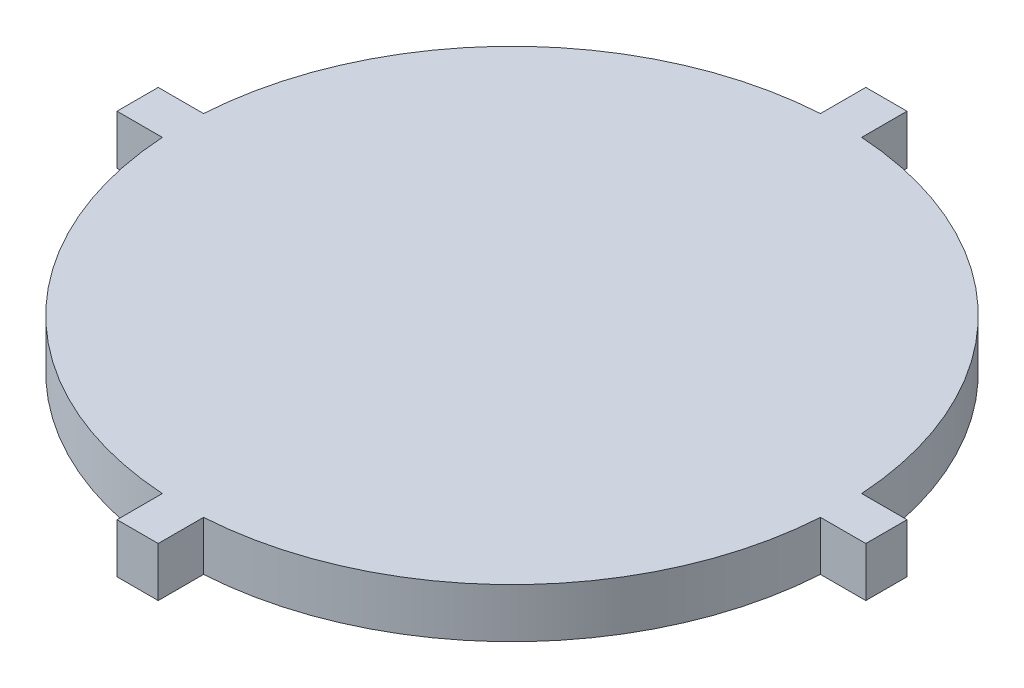
ISO-10303-21;
HEADER;
FILE_DESCRIPTION(('STEP AP214'),'2;1');
FILE_NAME('part.step','',(''),(''),'','','');
FILE_SCHEMA(('AUTOMOTIVE_DESIGN { 1 0 10303 214 1 1 1 1 }'));
ENDSEC;
DATA;
#1=APPLICATION_CONTEXT('core data for automotive mechanical design processes');
#2=APPLICATION_PROTOCOL_DEFINITION('international standard','automotive_design',2000,#1);
#3=PRODUCT_CONTEXT('',#1,'mechanical');
#4=PRODUCT('Part','Part','',(#3));
#5=PRODUCT_RELATED_PRODUCT_CATEGORY('part','',(#4));
#6=PRODUCT_DEFINITION_FORMATION('','',#4);
#7=PRODUCT_DEFINITION_CONTEXT('part definition',#1,'design');
#8=PRODUCT_DEFINITION('design','',#6,#7);
#9=PRODUCT_DEFINITION_SHAPE('','',#8);
#10=(LENGTH_UNIT() NAMED_UNIT(*) SI_UNIT(.MILLI.,.METRE.));
#11=(NAMED_UNIT(*) PLANE_ANGLE_UNIT() SI_UNIT($,.RADIAN.));
#12=(NAMED_UNIT(*) SI_UNIT($,.STERADIAN.) SOLID_ANGLE_UNIT());
#13=UNCERTAINTY_MEASURE_WITH_UNIT(LENGTH_MEASURE(1.E-05),#10,'distance_accuracy_value','');
#14=(GEOMETRIC_REPRESENTATION_CONTEXT(3) GLOBAL_UNCERTAINTY_ASSIGNED_CONTEXT((#13)) GLOBAL_UNIT_ASSIGNED_CONTEXT((#10,
#11,#12)) REPRESENTATION_CONTEXT('',''));
#15=CARTESIAN_POINT('',(0.,0.,0.));
#16=DIRECTION('',(0.,0.,1.));
#17=DIRECTION('',(1.,0.,0.));
#18=AXIS2_PLACEMENT_3D('',#15,#16,#17);
#19=CARTESIAN_POINT('',(0.,15.24,0.));
#20=DIRECTION('',(0.,-1.,0.));
#21=DIRECTION('',(0.,0.,-1.));
#22=AXIS2_PLACEMENT_3D('',#19,#20,#21);
#23=CYLINDRICAL_SURFACE('',#22,101.6);
#24=CARTESIAN_POINT('',(0.,0.,0.));
#25=DIRECTION('',(0.,1.,0.));
#26=DIRECTION('',(0.,0.,1.));
#27=AXIS2_PLACEMENT_3D('',#24,#25,#26);
#28=CIRCLE('',#27,101.6);
#29=CARTESIAN_POINT('',(101.401368333963,0.,-6.35));
#30=VERTEX_POINT('',#29);
#31=CARTESIAN_POINT('',(6.35000000000001,0.,-101.401368333963));
#32=VERTEX_POINT('',#31);
#33=EDGE_CURVE('E187',#30,#32,#28,.T.);
#34=ORIENTED_EDGE('',*,*,#33,.T.);
#35=DIRECTION('',(0.,-1.,0.));
#36=VECTOR('',#35,1.);
#37=CARTESIAN_POINT('',(6.35000000000001,15.24,-101.401368333963));
#38=LINE('',#37,#36);
#39=CARTESIAN_POINT('',(6.35000000000001,15.24,-101.401368333963));
#40=VERTEX_POINT('',#39);
#41=EDGE_CURVE('E11',#40,#32,#38,.T.);
#42=ORIENTED_EDGE('',*,*,#41,.F.);
#43=CARTESIAN_POINT('',(0.,15.24,0.));
#44=DIRECTION('',(0.,1.,0.));
#45=DIRECTION('',(0.,0.,1.));
#46=AXIS2_PLACEMENT_3D('',#43,#44,#45);
#47=CIRCLE('',#46,101.6);
#48=CARTESIAN_POINT('',(101.401368333963,15.24,-6.35));
#49=VERTEX_POINT('',#48);
#50=EDGE_CURVE('E217',#49,#40,#47,.T.);
#51=ORIENTED_EDGE('',*,*,#50,.F.);
#52=DIRECTION('',(0.,-1.,0.));
#53=VECTOR('',#52,1.);
#54=CARTESIAN_POINT('',(101.401368333963,15.24,-6.35));
#55=LINE('',#54,#53);
#56=EDGE_CURVE('E183',#49,#30,#55,.T.);
#57=ORIENTED_EDGE('',*,*,#56,.T.);
#58=EDGE_LOOP('',(#34,#42,#51,#57));
#59=FACE_BOUND('',#58,.T.);
#60=ADVANCED_FACE('F43',(#59),#23,.T.);
#61=CARTESIAN_POINT('',(6.35000000000001,15.24,-101.401368333963));
#62=DIRECTION('',(-1.,0.,0.));
#63=DIRECTION('',(0.,0.,1.));
#64=AXIS2_PLACEMENT_3D('',#61,#62,#63);
#65=PLANE('',#64);
#66=DIRECTION('',(0.,0.,-1.));
#67=VECTOR('',#66,1.);
#68=CARTESIAN_POINT('',(6.35000000000001,0.,-101.401368333963));
#69=LINE('',#68,#67);
#70=CARTESIAN_POINT('',(6.35,0.,-115.371368333963));
#71=VERTEX_POINT('',#70);
#72=EDGE_CURVE('E190',#32,#71,#69,.T.);
#73=ORIENTED_EDGE('',*,*,#72,.T.);
#74=DIRECTION('',(0.,-1.,0.));
#75=VECTOR('',#74,1.);
#76=CARTESIAN_POINT('',(6.35,15.24,-115.371368333963));
#77=LINE('',#76,#75);
#78=CARTESIAN_POINT('',(6.35,15.24,-115.371368333963));
#79=VERTEX_POINT('',#78);
#80=EDGE_CURVE('E51',#79,#71,#77,.T.);
#81=ORIENTED_EDGE('',*,*,#80,.F.);
#82=DIRECTION('',(0.,0.,-1.));
#83=VECTOR('',#82,1.);
#84=CARTESIAN_POINT('',(6.35000000000001,15.24,-101.401368333963));
#85=LINE('',#84,#83);
#86=EDGE_CURVE('E125',#40,#79,#85,.T.);
#87=ORIENTED_EDGE('',*,*,#86,.F.);
#88=ORIENTED_EDGE('',*,*,#41,.T.);
#89=EDGE_LOOP('',(#73,#81,#87,#88));
#90=FACE_BOUND('',#89,.T.);
#91=ADVANCED_FACE('F315',(#90),#65,.F.);
#92=CARTESIAN_POINT('',(-6.35,15.24,-115.371368333963));
#93=DIRECTION('',(0.,0.,1.));
#94=DIRECTION('',(1.,0.,0.));
#95=AXIS2_PLACEMENT_3D('',#92,#93,#94);
#96=PLANE('',#95);
#97=DIRECTION('',(-1.,0.,0.));
#98=VECTOR('',#97,1.);
#99=CARTESIAN_POINT('',(-6.35,0.,-115.371368333963));
#100=LINE('',#99,#98);
#101=CARTESIAN_POINT('',(-6.35,0.,-115.371368333963));
#102=VERTEX_POINT('',#101);
#103=EDGE_CURVE('E192',#71,#102,#100,.T.);
#104=ORIENTED_EDGE('',*,*,#103,.T.);
#105=DIRECTION('',(0.,-1.,0.));
#106=VECTOR('',#105,1.);
#107=CARTESIAN_POINT('',(-6.35,15.24,-115.371368333963));
#108=LINE('',#107,#106);
#109=CARTESIAN_POINT('',(-6.35,15.24,-115.371368333963));
#110=VERTEX_POINT('',#109);
#111=EDGE_CURVE('E248',#110,#102,#108,.T.);
#112=ORIENTED_EDGE('',*,*,#111,.F.);
#113=DIRECTION('',(-1.,0.,0.));
#114=VECTOR('',#113,1.);
#115=CARTESIAN_POINT('',(-6.35,15.24,-115.371368333963));
#116=LINE('',#115,#114);
#117=EDGE_CURVE('E256',#79,#110,#116,.T.);
#118=ORIENTED_EDGE('',*,*,#117,.F.);
#119=ORIENTED_EDGE('',*,*,#80,.T.);
#120=EDGE_LOOP('',(#104,#112,#118,#119));
#121=FACE_BOUND('',#120,.T.);
#122=ADVANCED_FACE('F254',(#121),#96,.F.);
#123=CARTESIAN_POINT('',(-6.34999999999999,15.24,-101.401368333963));
#124=DIRECTION('',(1.,0.,0.));
#125=DIRECTION('',(0.,0.,-1.));
#126=AXIS2_PLACEMENT_3D('',#123,#124,#125);
#127=PLANE('',#126);
#128=DIRECTION('',(0.,0.,1.));
#129=VECTOR('',#128,1.);
#130=CARTESIAN_POINT('',(-6.34999999999999,0.,-101.401368333963));
#131=LINE('',#130,#129);
#132=CARTESIAN_POINT('',(-6.34999999999999,0.,-101.401368333963));
#133=VERTEX_POINT('',#132);
#134=EDGE_CURVE('E194',#102,#133,#131,.T.);
#135=ORIENTED_EDGE('',*,*,#134,.T.);
#136=DIRECTION('',(0.,-1.,0.));
#137=VECTOR('',#136,1.);
#138=CARTESIAN_POINT('',(-6.34999999999999,15.24,-101.401368333963));
#139=LINE('',#138,#137);
#140=CARTESIAN_POINT('',(-6.34999999999999,15.24,-101.401368333963));
#141=VERTEX_POINT('',#140);
#142=EDGE_CURVE('E245',#141,#133,#139,.T.);
#143=ORIENTED_EDGE('',*,*,#142,.F.);
#144=DIRECTION('',(0.,0.,1.));
#145=VECTOR('',#144,1.);
#146=CARTESIAN_POINT('',(-6.34999999999999,15.24,-101.401368333963));
#147=LINE('',#146,#145);
#148=EDGE_CURVE('E274',#110,#141,#147,.T.);
#149=ORIENTED_EDGE('',*,*,#148,.F.);
#150=ORIENTED_EDGE('',*,*,#111,.T.);
#151=EDGE_LOOP('',(#135,#143,#149,#150));
#152=FACE_BOUND('',#151,.T.);
#153=ADVANCED_FACE('F265',(#152),#127,.F.);
#154=CARTESIAN_POINT('',(0.,15.24,0.));
#155=DIRECTION('',(0.,-1.,0.));
#156=DIRECTION('',(0.,0.,-1.));
#157=AXIS2_PLACEMENT_3D('',#154,#155,#156);
#158=CYLINDRICAL_SURFACE('',#157,101.6);
#159=CARTESIAN_POINT('',(0.,0.,0.));
#160=DIRECTION('',(0.,1.,0.));
#161=DIRECTION('',(0.,0.,1.));
#162=AXIS2_PLACEMENT_3D('',#159,#160,#161);
#163=CIRCLE('',#162,101.6);
#164=CARTESIAN_POINT('',(-101.401368333963,0.,-6.34999999999998));
#165=VERTEX_POINT('',#164);
#166=EDGE_CURVE('E196',#133,#165,#163,.T.);
#167=ORIENTED_EDGE('',*,*,#166,.T.);
#168=DIRECTION('',(0.,-1.,0.));
#169=VECTOR('',#168,1.);
#170=CARTESIAN_POINT('',(-101.401368333963,15.24,-6.34999999999998));
#171=LINE('',#170,#169);
#172=CARTESIAN_POINT('',(-101.401368333963,15.24,-6.34999999999998));
#173=VERTEX_POINT('',#172);
#174=EDGE_CURVE('E242',#173,#165,#171,.T.);
#175=ORIENTED_EDGE('',*,*,#174,.F.);
#176=CARTESIAN_POINT('',(0.,15.24,0.));
#177=DIRECTION('',(0.,1.,0.));
#178=DIRECTION('',(0.,0.,1.));
#179=AXIS2_PLACEMENT_3D('',#176,#177,#178);
#180=CIRCLE('',#179,101.6);
#181=EDGE_CURVE('E271',#141,#173,#180,.T.);
#182=ORIENTED_EDGE('',*,*,#181,.F.);
#183=ORIENTED_EDGE('',*,*,#142,.T.);
#184=EDGE_LOOP('',(#167,#175,#182,#183));
#185=FACE_BOUND('',#184,.T.);
#186=ADVANCED_FACE('F269',(#185),#158,.T.);
#187=CARTESIAN_POINT('',(-101.401368333963,15.24,-6.35));
#188=DIRECTION('',(0.,0.,1.));
#189=DIRECTION('',(1.,0.,0.));
#190=AXIS2_PLACEMENT_3D('',#187,#188,#189);
#191=PLANE('',#190);
#192=DIRECTION('',(-1.,0.,0.));
#193=VECTOR('',#192,1.);
#194=CARTESIAN_POINT('',(-101.401368333963,0.,-6.35));
#195=LINE('',#194,#193);
#196=CARTESIAN_POINT('',(-115.371368333963,0.,-6.35000000000072));
#197=VERTEX_POINT('',#196);
#198=EDGE_CURVE('E198',#165,#197,#195,.T.);
#199=ORIENTED_EDGE('',*,*,#198,.T.);
#200=DIRECTION('',(0.,-1.,0.));
#201=VECTOR('',#200,1.);
#202=CARTESIAN_POINT('',(-115.371368333963,15.24,-6.35000000000072));
#203=LINE('',#202,#201);
#204=CARTESIAN_POINT('',(-115.371368333963,15.24,-6.35000000000072));
#205=VERTEX_POINT('',#204);
#206=EDGE_CURVE('E239',#205,#197,#203,.T.);
#207=ORIENTED_EDGE('',*,*,#206,.F.);
#208=DIRECTION('',(-1.,0.,0.));
#209=VECTOR('',#208,1.);
#210=CARTESIAN_POINT('',(-101.401368333963,15.24,-6.35));
#211=LINE('',#210,#209);
#212=EDGE_CURVE('E273',#173,#205,#211,.T.);
#213=ORIENTED_EDGE('',*,*,#212,.F.);
#214=ORIENTED_EDGE('',*,*,#174,.T.);
#215=EDGE_LOOP('',(#199,#207,#213,#214));
#216=FACE_BOUND('',#215,.T.);
#217=ADVANCED_FACE('F328',(#216),#191,.F.);
#218=CARTESIAN_POINT('',(-115.371368333963,15.24,-6.35000000000072));
#219=DIRECTION('',(1.,0.,0.));
#220=DIRECTION('',(0.,0.,-1.));
#221=AXIS2_PLACEMENT_3D('',#218,#219,#220);
#222=PLANE('',#221);
#223=DIRECTION('',(0.,0.,1.));
#224=VECTOR('',#223,1.);
#225=CARTESIAN_POINT('',(-115.371368333963,0.,-6.35000000000072));
#226=LINE('',#225,#224);
#227=CARTESIAN_POINT('',(-115.371368333963,0.,6.34999999999928));
#228=VERTEX_POINT('',#227);
#229=EDGE_CURVE('E200',#197,#228,#226,.T.);
#230=ORIENTED_EDGE('',*,*,#229,.T.);
#231=DIRECTION('',(0.,-1.,0.));
#232=VECTOR('',#231,1.);
#233=CARTESIAN_POINT('',(-115.371368333963,15.24,6.34999999999928));
#234=LINE('',#233,#232);
#235=CARTESIAN_POINT('',(-115.371368333963,15.24,6.34999999999928));
#236=VERTEX_POINT('',#235);
#237=EDGE_CURVE('E236',#236,#228,#234,.T.);
#238=ORIENTED_EDGE('',*,*,#237,.F.);
#239=DIRECTION('',(0.,0.,1.));
#240=VECTOR('',#239,1.);
#241=CARTESIAN_POINT('',(-115.371368333963,15.24,-6.35000000000072));
#242=LINE('',#241,#240);
#243=EDGE_CURVE('E276',#205,#236,#242,.T.);
#244=ORIENTED_EDGE('',*,*,#243,.F.);
#245=ORIENTED_EDGE('',*,*,#206,.T.);
#246=EDGE_LOOP('',(#230,#238,#244,#245));
#247=FACE_BOUND('',#246,.T.);
#248=ADVANCED_FACE('F331',(#247),#222,.F.);
#249=CARTESIAN_POINT('',(-101.401368333963,15.24,6.35));
#250=DIRECTION('',(0.,0.,-1.));
#251=DIRECTION('',(-1.,0.,0.));
#252=AXIS2_PLACEMENT_3D('',#249,#250,#251);
#253=PLANE('',#252);
#254=DIRECTION('',(1.,0.,0.));
#255=VECTOR('',#254,1.);
#256=CARTESIAN_POINT('',(-101.401368333963,0.,6.35));
#257=LINE('',#256,#255);
#258=CARTESIAN_POINT('',(-101.401368333963,0.,6.35));
#259=VERTEX_POINT('',#258);
#260=EDGE_CURVE('E202',#228,#259,#257,.T.);
#261=ORIENTED_EDGE('',*,*,#260,.T.);
#262=DIRECTION('',(0.,-1.,0.));
#263=VECTOR('',#262,1.);
#264=CARTESIAN_POINT('',(-101.401368333963,15.24,6.35));
#265=LINE('',#264,#263);
#266=CARTESIAN_POINT('',(-101.401368333963,15.24,6.35));
#267=VERTEX_POINT('',#266);
#268=EDGE_CURVE('E233',#267,#259,#265,.T.);
#269=ORIENTED_EDGE('',*,*,#268,.F.);
#270=DIRECTION('',(1.,0.,0.));
#271=VECTOR('',#270,1.);
#272=CARTESIAN_POINT('',(-101.401368333963,15.24,6.35));
#273=LINE('',#272,#271);
#274=EDGE_CURVE('E282',#236,#267,#273,.T.);
#275=ORIENTED_EDGE('',*,*,#274,.F.);
#276=ORIENTED_EDGE('',*,*,#237,.T.);
#277=EDGE_LOOP('',(#261,#269,#275,#276));
#278=FACE_BOUND('',#277,.T.);
#279=ADVANCED_FACE('F335',(#278),#253,.F.);
#280=CARTESIAN_POINT('',(0.,15.24,0.));
#281=DIRECTION('',(0.,-1.,0.));
#282=DIRECTION('',(0.,0.,-1.));
#283=AXIS2_PLACEMENT_3D('',#280,#281,#282);
#284=CYLINDRICAL_SURFACE('',#283,101.6);
#285=CARTESIAN_POINT('',(0.,0.,0.));
#286=DIRECTION('',(0.,1.,0.));
#287=DIRECTION('',(0.,0.,1.));
#288=AXIS2_PLACEMENT_3D('',#285,#286,#287);
#289=CIRCLE('',#288,101.6);
#290=CARTESIAN_POINT('',(-6.34999999999999,0.,101.401368333963));
#291=VERTEX_POINT('',#290);
#292=EDGE_CURVE('E204',#259,#291,#289,.T.);
#293=ORIENTED_EDGE('',*,*,#292,.T.);
#294=DIRECTION('',(0.,-1.,0.));
#295=VECTOR('',#294,1.);
#296=CARTESIAN_POINT('',(-6.34999999999999,15.24,101.401368333963));
#297=LINE('',#296,#295);
#298=CARTESIAN_POINT('',(-6.34999999999999,15.24,101.401368333963));
#299=VERTEX_POINT('',#298);
#300=EDGE_CURVE('E230',#299,#291,#297,.T.);
#301=ORIENTED_EDGE('',*,*,#300,.F.);
#302=CARTESIAN_POINT('',(0.,15.24,0.));
#303=DIRECTION('',(0.,1.,0.));
#304=DIRECTION('',(0.,0.,1.));
#305=AXIS2_PLACEMENT_3D('',#302,#303,#304);
#306=CIRCLE('',#305,101.6);
#307=EDGE_CURVE('E284',#267,#299,#306,.T.);
#308=ORIENTED_EDGE('',*,*,#307,.F.);
#309=ORIENTED_EDGE('',*,*,#268,.T.);
#310=EDGE_LOOP('',(#293,#301,#308,#309));
#311=FACE_BOUND('',#310,.T.);
#312=ADVANCED_FACE('F339',(#311),#284,.T.);
#313=CARTESIAN_POINT('',(-6.34999999999999,15.24,101.401368333963));
#314=DIRECTION('',(1.,0.,0.));
#315=DIRECTION('',(0.,0.,-1.));
#316=AXIS2_PLACEMENT_3D('',#313,#314,#315);
#317=PLANE('',#316);
#318=DIRECTION('',(0.,0.,1.));
#319=VECTOR('',#318,1.);
#320=CARTESIAN_POINT('',(-6.34999999999999,0.,101.401368333963));
#321=LINE('',#320,#319);
#322=CARTESIAN_POINT('',(-6.34999999999999,0.,115.371368333963));
#323=VERTEX_POINT('',#322);
#324=EDGE_CURVE('E206',#291,#323,#321,.T.);
#325=ORIENTED_EDGE('',*,*,#324,.T.);
#326=DIRECTION('',(0.,-1.,0.));
#327=VECTOR('',#326,1.);
#328=CARTESIAN_POINT('',(-6.34999999999999,15.24,115.371368333963));
#329=LINE('',#328,#327);
#330=CARTESIAN_POINT('',(-6.34999999999999,15.24,115.371368333963));
#331=VERTEX_POINT('',#330);
#332=EDGE_CURVE('E227',#331,#323,#329,.T.);
#333=ORIENTED_EDGE('',*,*,#332,.F.);
#334=DIRECTION('',(0.,0.,1.));
#335=VECTOR('',#334,1.);
#336=CARTESIAN_POINT('',(-6.34999999999999,15.24,101.401368333963));
#337=LINE('',#336,#335);
#338=EDGE_CURVE('E286',#299,#331,#337,.T.);
#339=ORIENTED_EDGE('',*,*,#338,.F.);
#340=ORIENTED_EDGE('',*,*,#300,.T.);
#341=EDGE_LOOP('',(#325,#333,#339,#340));
#342=FACE_BOUND('',#341,.T.);
#343=ADVANCED_FACE('F343',(#342),#317,.F.);
#344=CARTESIAN_POINT('',(-6.34999999999999,15.24,115.371368333963));
#345=DIRECTION('',(0.,0.,-1.));
#346=DIRECTION('',(-1.,0.,0.));
#347=AXIS2_PLACEMENT_3D('',#344,#345,#346);
#348=PLANE('',#347);
#349=DIRECTION('',(1.,0.,0.));
#350=VECTOR('',#349,1.);
#351=CARTESIAN_POINT('',(-6.34999999999999,0.,115.371368333963));
#352=LINE('',#351,#350);
#353=CARTESIAN_POINT('',(6.35000000000001,0.,115.371368333963));
#354=VERTEX_POINT('',#353);
#355=EDGE_CURVE('E208',#323,#354,#352,.T.);
#356=ORIENTED_EDGE('',*,*,#355,.T.);
#357=DIRECTION('',(0.,-1.,0.));
#358=VECTOR('',#357,1.);
#359=CARTESIAN_POINT('',(6.35000000000001,15.24,115.371368333963));
#360=LINE('',#359,#358);
#361=CARTESIAN_POINT('',(6.35000000000001,15.24,115.371368333963));
#362=VERTEX_POINT('',#361);
#363=EDGE_CURVE('E224',#362,#354,#360,.T.);
#364=ORIENTED_EDGE('',*,*,#363,.F.);
#365=DIRECTION('',(1.,0.,0.));
#366=VECTOR('',#365,1.);
#367=CARTESIAN_POINT('',(-6.34999999999999,15.24,115.371368333963));
#368=LINE('',#367,#366);
#369=EDGE_CURVE('E288',#331,#362,#368,.T.);
#370=ORIENTED_EDGE('',*,*,#369,.F.);
#371=ORIENTED_EDGE('',*,*,#332,.T.);
#372=EDGE_LOOP('',(#356,#364,#370,#371));
#373=FACE_BOUND('',#372,.T.);
#374=ADVANCED_FACE('F347',(#373),#348,.F.);
#375=CARTESIAN_POINT('',(6.35000000000001,15.24,101.401368333963));
#376=DIRECTION('',(-1.,0.,0.));
#377=DIRECTION('',(0.,0.,1.));
#378=AXIS2_PLACEMENT_3D('',#375,#376,#377);
#379=PLANE('',#378);
#380=DIRECTION('',(0.,0.,-1.));
#381=VECTOR('',#380,1.);
#382=CARTESIAN_POINT('',(6.35000000000001,0.,101.401368333963));
#383=LINE('',#382,#381);
#384=CARTESIAN_POINT('',(6.35000000000001,0.,101.401368333963));
#385=VERTEX_POINT('',#384);
#386=EDGE_CURVE('E210',#354,#385,#383,.T.);
#387=ORIENTED_EDGE('',*,*,#386,.T.);
#388=DIRECTION('',(0.,-1.,0.));
#389=VECTOR('',#388,1.);
#390=CARTESIAN_POINT('',(6.35000000000001,15.24,101.401368333963));
#391=LINE('',#390,#389);
#392=CARTESIAN_POINT('',(6.35000000000001,15.24,101.401368333963));
#393=VERTEX_POINT('',#392);
#394=EDGE_CURVE('E221',#393,#385,#391,.T.);
#395=ORIENTED_EDGE('',*,*,#394,.F.);
#396=DIRECTION('',(0.,0.,-1.));
#397=VECTOR('',#396,1.);
#398=CARTESIAN_POINT('',(6.35000000000001,15.24,101.401368333963));
#399=LINE('',#398,#397);
#400=EDGE_CURVE('E290',#362,#393,#399,.T.);
#401=ORIENTED_EDGE('',*,*,#400,.F.);
#402=ORIENTED_EDGE('',*,*,#363,.T.);
#403=EDGE_LOOP('',(#387,#395,#401,#402));
#404=FACE_BOUND('',#403,.T.);
#405=ADVANCED_FACE('F296',(#404),#379,.F.);
#406=CARTESIAN_POINT('',(0.,15.24,0.));
#407=DIRECTION('',(0.,-1.,0.));
#408=DIRECTION('',(0.,0.,-1.));
#409=AXIS2_PLACEMENT_3D('',#406,#407,#408);
#410=CYLINDRICAL_SURFACE('',#409,101.6);
#411=CARTESIAN_POINT('',(0.,0.,0.));
#412=DIRECTION('',(0.,1.,0.));
#413=DIRECTION('',(0.,0.,1.));
#414=AXIS2_PLACEMENT_3D('',#411,#412,#413);
#415=CIRCLE('',#414,101.6);
#416=CARTESIAN_POINT('',(101.401368333963,0.,6.34999999999999));
#417=VERTEX_POINT('',#416);
#418=EDGE_CURVE('E212',#385,#417,#415,.T.);
#419=ORIENTED_EDGE('',*,*,#418,.T.);
#420=DIRECTION('',(0.,-1.,0.));
#421=VECTOR('',#420,1.);
#422=CARTESIAN_POINT('',(101.401368333963,15.24,6.34999999999999));
#423=LINE('',#422,#421);
#424=CARTESIAN_POINT('',(101.401368333963,15.24,6.34999999999999));
#425=VERTEX_POINT('',#424);
#426=EDGE_CURVE('E178',#425,#417,#423,.T.);
#427=ORIENTED_EDGE('',*,*,#426,.F.);
#428=CARTESIAN_POINT('',(0.,15.24,0.));
#429=DIRECTION('',(0.,1.,0.));
#430=DIRECTION('',(0.,0.,1.));
#431=AXIS2_PLACEMENT_3D('',#428,#429,#430);
#432=CIRCLE('',#431,101.6);
#433=EDGE_CURVE('E168',#393,#425,#432,.T.);
#434=ORIENTED_EDGE('',*,*,#433,.F.);
#435=ORIENTED_EDGE('',*,*,#394,.T.);
#436=EDGE_LOOP('',(#419,#427,#434,#435));
#437=FACE_BOUND('',#436,.T.);
#438=ADVANCED_FACE('F300',(#437),#410,.T.);
#439=CARTESIAN_POINT('',(115.371368333963,15.24,6.35));
#440=DIRECTION('',(0.,0.,-1.));
#441=DIRECTION('',(-1.,0.,0.));
#442=AXIS2_PLACEMENT_3D('',#439,#440,#441);
#443=PLANE('',#442);
#444=DIRECTION('',(1.,0.,0.));
#445=VECTOR('',#444,1.);
#446=CARTESIAN_POINT('',(115.371368333963,0.,6.35));
#447=LINE('',#446,#445);
#448=CARTESIAN_POINT('',(115.371368333963,0.,6.35));
#449=VERTEX_POINT('',#448);
#450=EDGE_CURVE('E177',#417,#449,#447,.T.);
#451=ORIENTED_EDGE('',*,*,#450,.T.);
#452=DIRECTION('',(0.,-1.,0.));
#453=VECTOR('',#452,1.);
#454=CARTESIAN_POINT('',(115.371368333963,15.24,6.35));
#455=LINE('',#454,#453);
#456=CARTESIAN_POINT('',(115.371368333963,15.24,6.35));
#457=VERTEX_POINT('',#456);
#458=EDGE_CURVE('E174',#457,#449,#455,.T.);
#459=ORIENTED_EDGE('',*,*,#458,.F.);
#460=DIRECTION('',(1.,0.,0.));
#461=VECTOR('',#460,1.);
#462=CARTESIAN_POINT('',(115.371368333963,15.24,6.35));
#463=LINE('',#462,#461);
#464=EDGE_CURVE('E162',#425,#457,#463,.T.);
#465=ORIENTED_EDGE('',*,*,#464,.F.);
#466=ORIENTED_EDGE('',*,*,#426,.T.);
#467=EDGE_LOOP('',(#451,#459,#465,#466));
#468=FACE_BOUND('',#467,.T.);
#469=ADVANCED_FACE('F175',(#468),#443,.F.);
#470=CARTESIAN_POINT('',(115.371368333963,15.24,3.17500000000013));
#471=DIRECTION('',(-1.,0.,0.));
#472=DIRECTION('',(0.,0.,1.));
#473=AXIS2_PLACEMENT_3D('',#470,#471,#472);
#474=PLANE('',#473);
#475=DIRECTION('',(0.,0.,-1.));
#476=VECTOR('',#475,1.);
#477=CARTESIAN_POINT('',(115.371368333963,0.,3.17500000000013));
#478=LINE('',#477,#476);
#479=CARTESIAN_POINT('',(115.371368333963,0.,-6.35));
#480=VERTEX_POINT('',#479);
#481=EDGE_CURVE('E111',#449,#480,#478,.T.);
#482=ORIENTED_EDGE('',*,*,#481,.T.);
#483=DIRECTION('',(0.,-1.,0.));
#484=VECTOR('',#483,1.);
#485=CARTESIAN_POINT('',(115.371368333963,15.24,-6.35));
#486=LINE('',#485,#484);
#487=CARTESIAN_POINT('',(115.371368333963,15.24,-6.35));
#488=VERTEX_POINT('',#487);
#489=EDGE_CURVE('E179',#488,#480,#486,.T.);
#490=ORIENTED_EDGE('',*,*,#489,.F.);
#491=DIRECTION('',(0.,0.,-1.));
#492=VECTOR('',#491,1.);
#493=CARTESIAN_POINT('',(115.371368333963,15.24,3.17500000000013));
#494=LINE('',#493,#492);
#495=EDGE_CURVE('E166',#457,#488,#494,.T.);
#496=ORIENTED_EDGE('',*,*,#495,.F.);
#497=ORIENTED_EDGE('',*,*,#458,.T.);
#498=EDGE_LOOP('',(#482,#490,#496,#497));
#499=FACE_BOUND('',#498,.T.);
#500=ADVANCED_FACE('F181',(#499),#474,.F.);
#501=CARTESIAN_POINT('',(115.371368333963,15.24,-6.35));
#502=DIRECTION('',(0.,0.,1.));
#503=DIRECTION('',(1.,0.,0.));
#504=AXIS2_PLACEMENT_3D('',#501,#502,#503);
#505=PLANE('',#504);
#506=DIRECTION('',(-1.,0.,0.));
#507=VECTOR('',#506,1.);
#508=CARTESIAN_POINT('',(115.371368333963,0.,-6.35));
#509=LINE('',#508,#507);
#510=EDGE_CURVE('E117',#480,#30,#509,.T.);
#511=ORIENTED_EDGE('',*,*,#510,.T.);
#512=ORIENTED_EDGE('',*,*,#56,.F.);
#513=DIRECTION('',(-1.,0.,0.));
#514=VECTOR('',#513,1.);
#515=CARTESIAN_POINT('',(115.371368333963,15.24,-6.35));
#516=LINE('',#515,#514);
#517=EDGE_CURVE('E59',#488,#49,#516,.T.);
#518=ORIENTED_EDGE('',*,*,#517,.F.);
#519=ORIENTED_EDGE('',*,*,#489,.T.);
#520=EDGE_LOOP('',(#511,#512,#518,#519));
#521=FACE_BOUND('',#520,.T.);
#522=ADVANCED_FACE('F304',(#521),#505,.F.);
#523=CARTESIAN_POINT('',(0.,15.24,0.));
#524=DIRECTION('',(0.,1.,0.));
#525=DIRECTION('',(0.,0.,1.));
#526=AXIS2_PLACEMENT_3D('',#523,#524,#525);
#527=PLANE('',#526);
#528=ORIENTED_EDGE('',*,*,#50,.T.);
#529=ORIENTED_EDGE('',*,*,#86,.T.);
#530=ORIENTED_EDGE('',*,*,#117,.T.);
#531=ORIENTED_EDGE('',*,*,#148,.T.);
#532=ORIENTED_EDGE('',*,*,#181,.T.);
#533=ORIENTED_EDGE('',*,*,#212,.T.);
#534=ORIENTED_EDGE('',*,*,#243,.T.);
#535=ORIENTED_EDGE('',*,*,#274,.T.);
#536=ORIENTED_EDGE('',*,*,#307,.T.);
#537=ORIENTED_EDGE('',*,*,#338,.T.);
#538=ORIENTED_EDGE('',*,*,#369,.T.);
#539=ORIENTED_EDGE('',*,*,#400,.T.);
#540=ORIENTED_EDGE('',*,*,#433,.T.);
#541=ORIENTED_EDGE('',*,*,#464,.T.);
#542=ORIENTED_EDGE('',*,*,#495,.T.);
#543=ORIENTED_EDGE('',*,*,#517,.T.);
#544=EDGE_LOOP('',(#528,#529,#530,#531,#532,#533,#534,#535,#536,#537,#538,#539,#540,#541,#542,#543));
#545=FACE_BOUND('',#544,.T.);
#546=ADVANCED_FACE('F164',(#545),#527,.T.);
#547=CARTESIAN_POINT('',(0.,0.,0.));
#548=DIRECTION('',(0.,1.,0.));
#549=DIRECTION('',(0.,0.,1.));
#550=AXIS2_PLACEMENT_3D('',#547,#548,#549);
#551=PLANE('',#550);
#552=ORIENTED_EDGE('',*,*,#33,.F.);
#553=ORIENTED_EDGE('',*,*,#510,.F.);
#554=ORIENTED_EDGE('',*,*,#481,.F.);
#555=ORIENTED_EDGE('',*,*,#450,.F.);
#556=ORIENTED_EDGE('',*,*,#418,.F.);
#557=ORIENTED_EDGE('',*,*,#386,.F.);
#558=ORIENTED_EDGE('',*,*,#355,.F.);
#559=ORIENTED_EDGE('',*,*,#324,.F.);
#560=ORIENTED_EDGE('',*,*,#292,.F.);
#561=ORIENTED_EDGE('',*,*,#260,.F.);
#562=ORIENTED_EDGE('',*,*,#229,.F.);
#563=ORIENTED_EDGE('',*,*,#198,.F.);
#564=ORIENTED_EDGE('',*,*,#166,.F.);
#565=ORIENTED_EDGE('',*,*,#134,.F.);
#566=ORIENTED_EDGE('',*,*,#103,.F.);
#567=ORIENTED_EDGE('',*,*,#72,.F.);
#568=EDGE_LOOP('',(#552,#553,#554,#555,#556,#557,#558,#559,#560,#561,#562,#563,#564,#565,#566,#567));
#569=FACE_BOUND('',#568,.T.);
#570=ADVANCED_FACE('F260',(#569),#551,.F.);
#571=CLOSED_SHELL('',(#60,#91,#122,#153,#186,#217,#248,#279,#312,#343,#374,#405,#438,#469,#500,
#522,#546,#570));
#572=MANIFOLD_SOLID_BREP('B2',#571);
#573=ADVANCED_BREP_SHAPE_REPRESENTATION('',(#18,#572),#14);
#574=SHAPE_DEFINITION_REPRESENTATION(#9,#573);
ENDSEC;
END-ISO-10303-21;
